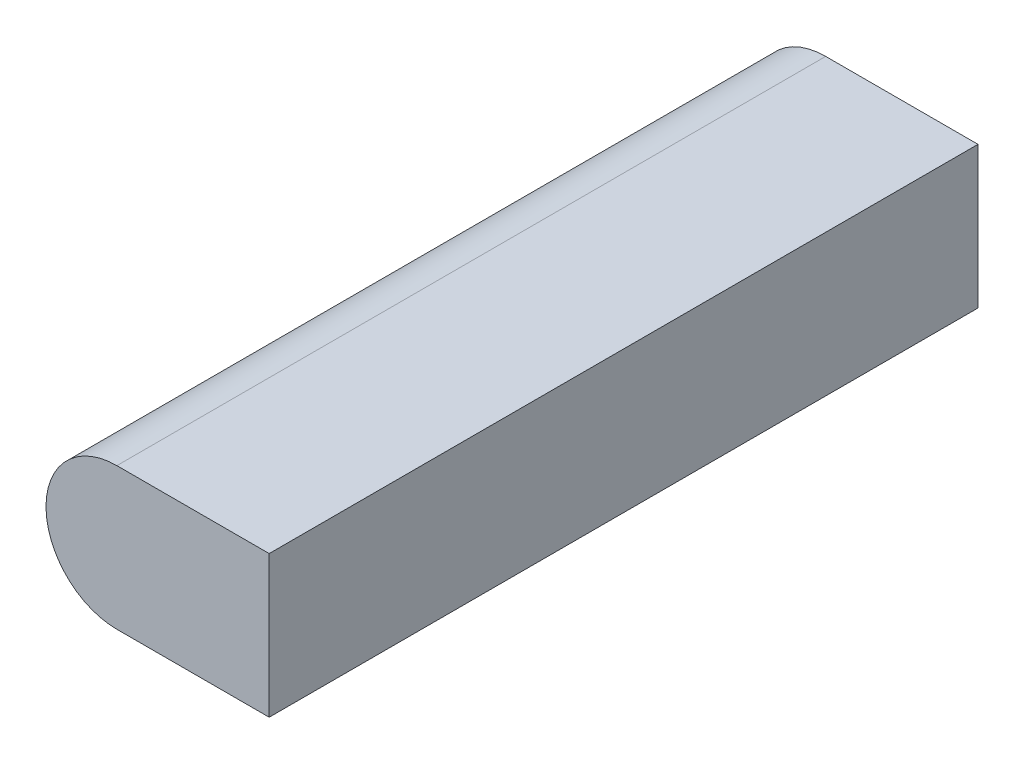
ISO-10303-21;
HEADER;
FILE_DESCRIPTION(('STEP AP214'),'2;1');
FILE_NAME('part.step','',(''),(''),'','','');
FILE_SCHEMA(('AUTOMOTIVE_DESIGN { 1 0 10303 214 1 1 1 1 }'));
ENDSEC;
DATA;
#1=APPLICATION_CONTEXT('core data for automotive mechanical design processes');
#2=APPLICATION_PROTOCOL_DEFINITION('international standard','automotive_design',2000,#1);
#3=PRODUCT_CONTEXT('',#1,'mechanical');
#4=PRODUCT('Part','Part','',(#3));
#5=PRODUCT_RELATED_PRODUCT_CATEGORY('part','',(#4));
#6=PRODUCT_DEFINITION_FORMATION('','',#4);
#7=PRODUCT_DEFINITION_CONTEXT('part definition',#1,'design');
#8=PRODUCT_DEFINITION('design','',#6,#7);
#9=PRODUCT_DEFINITION_SHAPE('','',#8);
#10=(LENGTH_UNIT() NAMED_UNIT(*) SI_UNIT(.MILLI.,.METRE.));
#11=(NAMED_UNIT(*) PLANE_ANGLE_UNIT() SI_UNIT($,.RADIAN.));
#12=(NAMED_UNIT(*) SI_UNIT($,.STERADIAN.) SOLID_ANGLE_UNIT());
#13=UNCERTAINTY_MEASURE_WITH_UNIT(LENGTH_MEASURE(1.E-05),#10,'distance_accuracy_value','');
#14=(GEOMETRIC_REPRESENTATION_CONTEXT(3) GLOBAL_UNCERTAINTY_ASSIGNED_CONTEXT((#13)) GLOBAL_UNIT_ASSIGNED_CONTEXT((#10,
#11,#12)) REPRESENTATION_CONTEXT('',''));
#15=CARTESIAN_POINT('',(0.,0.,0.));
#16=DIRECTION('',(0.,0.,1.));
#17=DIRECTION('',(1.,0.,0.));
#18=AXIS2_PLACEMENT_3D('',#15,#16,#17);
#19=CARTESIAN_POINT('',(0.,0.,10.));
#20=DIRECTION('',(0.,0.,-1.));
#21=DIRECTION('',(-1.,0.,0.));
#22=AXIS2_PLACEMENT_3D('',#19,#20,#21);
#23=CYLINDRICAL_SURFACE('',#22,1.);
#24=CARTESIAN_POINT('',(0.,0.,0.));
#25=DIRECTION('',(0.,0.,1.));
#26=DIRECTION('',(1.,0.,0.));
#27=AXIS2_PLACEMENT_3D('',#24,#25,#26);
#28=CIRCLE('',#27,1.);
#29=CARTESIAN_POINT('',(0.,1.,0.));
#30=VERTEX_POINT('',#29);
#31=CARTESIAN_POINT('',(0.,-1.,0.));
#32=VERTEX_POINT('',#31);
#33=EDGE_CURVE('E113',#30,#32,#28,.T.);
#34=ORIENTED_EDGE('',*,*,#33,.T.);
#35=DIRECTION('',(0.,0.,-1.));
#36=VECTOR('',#35,1.);
#37=CARTESIAN_POINT('',(0.,-1.,10.));
#38=LINE('',#37,#36);
#39=CARTESIAN_POINT('',(0.,-1.,10.));
#40=VERTEX_POINT('',#39);
#41=EDGE_CURVE('E11',#40,#32,#38,.T.);
#42=ORIENTED_EDGE('',*,*,#41,.F.);
#43=CARTESIAN_POINT('',(0.,0.,10.));
#44=DIRECTION('',(0.,0.,1.));
#45=DIRECTION('',(1.,0.,0.));
#46=AXIS2_PLACEMENT_3D('',#43,#44,#45);
#47=CIRCLE('',#46,1.);
#48=CARTESIAN_POINT('',(0.,1.,10.));
#49=VERTEX_POINT('',#48);
#50=EDGE_CURVE('E97',#49,#40,#47,.T.);
#51=ORIENTED_EDGE('',*,*,#50,.F.);
#52=DIRECTION('',(0.,0.,-1.));
#53=VECTOR('',#52,1.);
#54=CARTESIAN_POINT('',(0.,1.,10.));
#55=LINE('',#54,#53);
#56=EDGE_CURVE('E109',#49,#30,#55,.T.);
#57=ORIENTED_EDGE('',*,*,#56,.T.);
#58=EDGE_LOOP('',(#34,#42,#51,#57));
#59=FACE_BOUND('',#58,.T.);
#60=ADVANCED_FACE('F45',(#59),#23,.T.);
#61=CARTESIAN_POINT('',(2.14884336201248,-1.,10.));
#62=DIRECTION('',(0.,1.,0.));
#63=DIRECTION('',(0.,0.,1.));
#64=AXIS2_PLACEMENT_3D('',#61,#62,#63);
#65=PLANE('',#64);
#66=DIRECTION('',(1.,0.,0.));
#67=VECTOR('',#66,1.);
#68=CARTESIAN_POINT('',(2.14884336201248,-1.,0.));
#69=LINE('',#68,#67);
#70=CARTESIAN_POINT('',(2.14884336201248,-1.,0.));
#71=VERTEX_POINT('',#70);
#72=EDGE_CURVE('E102',#32,#71,#69,.T.);
#73=ORIENTED_EDGE('',*,*,#72,.T.);
#74=DIRECTION('',(0.,0.,-1.));
#75=VECTOR('',#74,1.);
#76=CARTESIAN_POINT('',(2.14884336201248,-1.,10.));
#77=LINE('',#76,#75);
#78=CARTESIAN_POINT('',(2.14884336201248,-1.,10.));
#79=VERTEX_POINT('',#78);
#80=EDGE_CURVE('E54',#79,#71,#77,.T.);
#81=ORIENTED_EDGE('',*,*,#80,.F.);
#82=DIRECTION('',(1.,0.,0.));
#83=VECTOR('',#82,1.);
#84=CARTESIAN_POINT('',(2.14884336201248,-1.,10.));
#85=LINE('',#84,#83);
#86=EDGE_CURVE('E92',#40,#79,#85,.T.);
#87=ORIENTED_EDGE('',*,*,#86,.F.);
#88=ORIENTED_EDGE('',*,*,#41,.T.);
#89=EDGE_LOOP('',(#73,#81,#87,#88));
#90=FACE_BOUND('',#89,.T.);
#91=ADVANCED_FACE('F101',(#90),#65,.F.);
#92=CARTESIAN_POINT('',(2.14884336201248,1.,10.));
#93=DIRECTION('',(-1.,0.,0.));
#94=DIRECTION('',(0.,0.,1.));
#95=AXIS2_PLACEMENT_3D('',#92,#93,#94);
#96=PLANE('',#95);
#97=DIRECTION('',(0.,1.,0.));
#98=VECTOR('',#97,1.);
#99=CARTESIAN_POINT('',(2.14884336201248,1.,0.));
#100=LINE('',#99,#98);
#101=CARTESIAN_POINT('',(2.14884336201248,1.,0.));
#102=VERTEX_POINT('',#101);
#103=EDGE_CURVE('E79',#71,#102,#100,.T.);
#104=ORIENTED_EDGE('',*,*,#103,.T.);
#105=DIRECTION('',(0.,0.,-1.));
#106=VECTOR('',#105,1.);
#107=CARTESIAN_POINT('',(2.14884336201248,1.,10.));
#108=LINE('',#107,#106);
#109=CARTESIAN_POINT('',(2.14884336201248,1.,10.));
#110=VERTEX_POINT('',#109);
#111=EDGE_CURVE('E104',#110,#102,#108,.T.);
#112=ORIENTED_EDGE('',*,*,#111,.F.);
#113=DIRECTION('',(0.,1.,0.));
#114=VECTOR('',#113,1.);
#115=CARTESIAN_POINT('',(2.14884336201248,1.,10.));
#116=LINE('',#115,#114);
#117=EDGE_CURVE('E95',#79,#110,#116,.T.);
#118=ORIENTED_EDGE('',*,*,#117,.F.);
#119=ORIENTED_EDGE('',*,*,#80,.T.);
#120=EDGE_LOOP('',(#104,#112,#118,#119));
#121=FACE_BOUND('',#120,.T.);
#122=ADVANCED_FACE('F105',(#121),#96,.F.);
#123=CARTESIAN_POINT('',(0.,1.,10.));
#124=DIRECTION('',(0.,-1.,0.));
#125=DIRECTION('',(0.,0.,-1.));
#126=AXIS2_PLACEMENT_3D('',#123,#124,#125);
#127=PLANE('',#126);
#128=DIRECTION('',(-1.,0.,0.));
#129=VECTOR('',#128,1.);
#130=CARTESIAN_POINT('',(0.,1.,0.));
#131=LINE('',#130,#129);
#132=EDGE_CURVE('E85',#102,#30,#131,.T.);
#133=ORIENTED_EDGE('',*,*,#132,.T.);
#134=ORIENTED_EDGE('',*,*,#56,.F.);
#135=DIRECTION('',(-1.,0.,0.));
#136=VECTOR('',#135,1.);
#137=CARTESIAN_POINT('',(0.,1.,10.));
#138=LINE('',#137,#136);
#139=EDGE_CURVE('E62',#110,#49,#138,.T.);
#140=ORIENTED_EDGE('',*,*,#139,.F.);
#141=ORIENTED_EDGE('',*,*,#111,.T.);
#142=EDGE_LOOP('',(#133,#134,#140,#141));
#143=FACE_BOUND('',#142,.T.);
#144=ADVANCED_FACE('F126',(#143),#127,.F.);
#145=CARTESIAN_POINT('',(0.,0.,10.));
#146=DIRECTION('',(0.,0.,1.));
#147=DIRECTION('',(1.,0.,0.));
#148=AXIS2_PLACEMENT_3D('',#145,#146,#147);
#149=PLANE('',#148);
#150=ORIENTED_EDGE('',*,*,#50,.T.);
#151=ORIENTED_EDGE('',*,*,#86,.T.);
#152=ORIENTED_EDGE('',*,*,#117,.T.);
#153=ORIENTED_EDGE('',*,*,#139,.T.);
#154=EDGE_LOOP('',(#150,#151,#152,#153));
#155=FACE_BOUND('',#154,.T.);
#156=ADVANCED_FACE('F93',(#155),#149,.T.);
#157=CARTESIAN_POINT('',(0.,0.,0.));
#158=DIRECTION('',(0.,0.,1.));
#159=DIRECTION('',(1.,0.,0.));
#160=AXIS2_PLACEMENT_3D('',#157,#158,#159);
#161=PLANE('',#160);
#162=ORIENTED_EDGE('',*,*,#33,.F.);
#163=ORIENTED_EDGE('',*,*,#132,.F.);
#164=ORIENTED_EDGE('',*,*,#103,.F.);
#165=ORIENTED_EDGE('',*,*,#72,.F.);
#166=EDGE_LOOP('',(#162,#163,#164,#165));
#167=FACE_BOUND('',#166,.T.);
#168=ADVANCED_FACE('F129',(#167),#161,.F.);
#169=CLOSED_SHELL('',(#60,#91,#122,#144,#156,#168));
#170=MANIFOLD_SOLID_BREP('B2',#169);
#171=ADVANCED_BREP_SHAPE_REPRESENTATION('',(#18,#170),#14);
#172=SHAPE_DEFINITION_REPRESENTATION(#9,#171);
ENDSEC;
END-ISO-10303-21;
